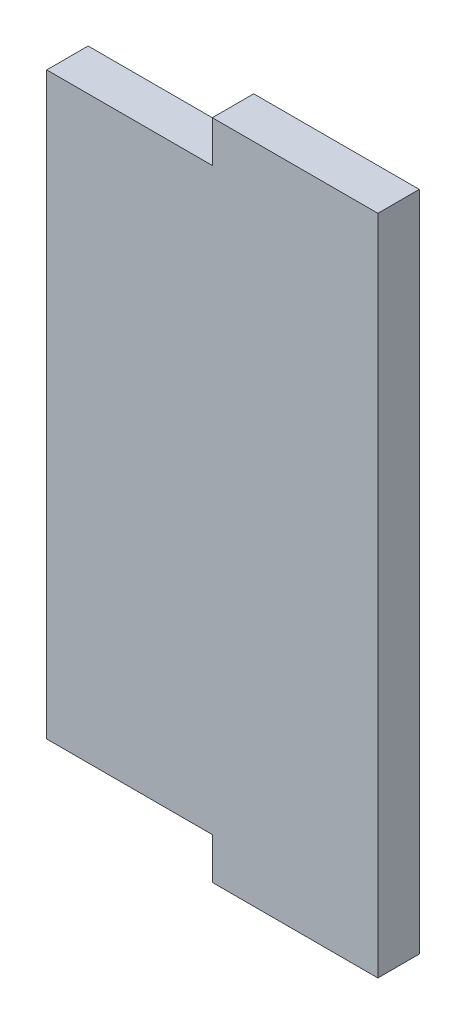
ISO-10303-21;
HEADER;
FILE_DESCRIPTION(('STEP AP214'),'2;1');
FILE_NAME('part.step','',(''),(''),'','','');
FILE_SCHEMA(('AUTOMOTIVE_DESIGN { 1 0 10303 214 1 1 1 1 }'));
ENDSEC;
DATA;
#1=APPLICATION_CONTEXT('core data for automotive mechanical design processes');
#2=APPLICATION_PROTOCOL_DEFINITION('international standard','automotive_design',2000,#1);
#3=PRODUCT_CONTEXT('',#1,'mechanical');
#4=PRODUCT('Part','Part','',(#3));
#5=PRODUCT_RELATED_PRODUCT_CATEGORY('part','',(#4));
#6=PRODUCT_DEFINITION_FORMATION('','',#4);
#7=PRODUCT_DEFINITION_CONTEXT('part definition',#1,'design');
#8=PRODUCT_DEFINITION('design','',#6,#7);
#9=PRODUCT_DEFINITION_SHAPE('','',#8);
#10=(LENGTH_UNIT() NAMED_UNIT(*) SI_UNIT(.MILLI.,.METRE.));
#11=(NAMED_UNIT(*) PLANE_ANGLE_UNIT() SI_UNIT($,.RADIAN.));
#12=(NAMED_UNIT(*) SI_UNIT($,.STERADIAN.) SOLID_ANGLE_UNIT());
#13=UNCERTAINTY_MEASURE_WITH_UNIT(LENGTH_MEASURE(1.E-05),#10,'distance_accuracy_value','');
#14=(GEOMETRIC_REPRESENTATION_CONTEXT(3) GLOBAL_UNCERTAINTY_ASSIGNED_CONTEXT((#13)) GLOBAL_UNIT_ASSIGNED_CONTEXT((#10,
#11,#12)) REPRESENTATION_CONTEXT('',''));
#15=CARTESIAN_POINT('',(0.,0.,0.));
#16=DIRECTION('',(0.,0.,1.));
#17=DIRECTION('',(1.,0.,0.));
#18=AXIS2_PLACEMENT_3D('',#15,#16,#17);
#19=CARTESIAN_POINT('',(98.425,0.,3.175));
#20=DIRECTION('',(0.,-1.,0.));
#21=DIRECTION('',(0.,0.,-1.));
#22=AXIS2_PLACEMENT_3D('',#19,#20,#21);
#23=PLANE('',#22);
#24=DIRECTION('',(-1.,0.,0.));
#25=VECTOR('',#24,1.);
#26=CARTESIAN_POINT('',(98.425,0.,0.));
#27=LINE('',#26,#25);
#28=CARTESIAN_POINT('',(98.425,0.,0.));
#29=VERTEX_POINT('',#28);
#30=CARTESIAN_POINT('',(85.725,0.,0.));
#31=VERTEX_POINT('',#30);
#32=EDGE_CURVE('E129',#29,#31,#27,.T.);
#33=ORIENTED_EDGE('',*,*,#32,.T.);
#34=DIRECTION('',(0.,0.,-1.));
#35=VECTOR('',#34,1.);
#36=CARTESIAN_POINT('',(85.725,0.,3.175));
#37=LINE('',#36,#35);
#38=CARTESIAN_POINT('',(85.725,0.,3.175));
#39=VERTEX_POINT('',#38);
#40=EDGE_CURVE('E11',#39,#31,#37,.T.);
#41=ORIENTED_EDGE('',*,*,#40,.F.);
#42=DIRECTION('',(-1.,0.,0.));
#43=VECTOR('',#42,1.);
#44=CARTESIAN_POINT('',(98.425,0.,3.175));
#45=LINE('',#44,#43);
#46=CARTESIAN_POINT('',(98.425,0.,3.175));
#47=VERTEX_POINT('',#46);
#48=EDGE_CURVE('E148',#47,#39,#45,.T.);
#49=ORIENTED_EDGE('',*,*,#48,.F.);
#50=DIRECTION('',(0.,0.,-1.));
#51=VECTOR('',#50,1.);
#52=CARTESIAN_POINT('',(98.425,0.,3.175));
#53=LINE('',#52,#51);
#54=EDGE_CURVE('E49',#47,#29,#53,.T.);
#55=ORIENTED_EDGE('',*,*,#54,.T.);
#56=EDGE_LOOP('',(#33,#41,#49,#55));
#57=FACE_BOUND('',#56,.T.);
#58=ADVANCED_FACE('F33',(#57),#23,.F.);
#59=CARTESIAN_POINT('',(85.725,0.,3.175));
#60=DIRECTION('',(1.,0.,0.));
#61=DIRECTION('',(0.,0.,-1.));
#62=AXIS2_PLACEMENT_3D('',#59,#60,#61);
#63=PLANE('',#62);
#64=DIRECTION('',(0.,-1.,0.));
#65=VECTOR('',#64,1.);
#66=CARTESIAN_POINT('',(85.725,0.,0.));
#67=LINE('',#66,#65);
#68=CARTESIAN_POINT('',(85.725,-3.175,0.));
#69=VERTEX_POINT('',#68);
#70=EDGE_CURVE('E131',#31,#69,#67,.T.);
#71=ORIENTED_EDGE('',*,*,#70,.T.);
#72=DIRECTION('',(0.,0.,-1.));
#73=VECTOR('',#72,1.);
#74=CARTESIAN_POINT('',(85.725,-3.175,3.175));
#75=LINE('',#74,#73);
#76=CARTESIAN_POINT('',(85.725,-3.175,3.175));
#77=VERTEX_POINT('',#76);
#78=EDGE_CURVE('E41',#77,#69,#75,.T.);
#79=ORIENTED_EDGE('',*,*,#78,.F.);
#80=DIRECTION('',(0.,-1.,0.));
#81=VECTOR('',#80,1.);
#82=CARTESIAN_POINT('',(85.725,0.,3.175));
#83=LINE('',#82,#81);
#84=EDGE_CURVE('E87',#39,#77,#83,.T.);
#85=ORIENTED_EDGE('',*,*,#84,.F.);
#86=ORIENTED_EDGE('',*,*,#40,.T.);
#87=EDGE_LOOP('',(#71,#79,#85,#86));
#88=FACE_BOUND('',#87,.T.);
#89=ADVANCED_FACE('F162',(#88),#63,.F.);
#90=CARTESIAN_POINT('',(73.025,-3.175,3.175));
#91=DIRECTION('',(0.,1.,0.));
#92=DIRECTION('',(0.,0.,1.));
#93=AXIS2_PLACEMENT_3D('',#90,#91,#92);
#94=PLANE('',#93);
#95=DIRECTION('',(1.,0.,0.));
#96=VECTOR('',#95,1.);
#97=CARTESIAN_POINT('',(73.025,-3.175,0.));
#98=LINE('',#97,#96);
#99=CARTESIAN_POINT('',(73.025,-3.175,0.));
#100=VERTEX_POINT('',#99);
#101=EDGE_CURVE('E134',#100,#69,#98,.T.);
#102=ORIENTED_EDGE('',*,*,#101,.F.);
#103=DIRECTION('',(0.,0.,-1.));
#104=VECTOR('',#103,1.);
#105=CARTESIAN_POINT('',(73.025,-3.175,3.175));
#106=LINE('',#105,#104);
#107=CARTESIAN_POINT('',(73.025,-3.175,3.175));
#108=VERTEX_POINT('',#107);
#109=EDGE_CURVE('E155',#108,#100,#106,.T.);
#110=ORIENTED_EDGE('',*,*,#109,.F.);
#111=DIRECTION('',(1.,0.,0.));
#112=VECTOR('',#111,1.);
#113=CARTESIAN_POINT('',(73.025,-3.175,3.175));
#114=LINE('',#113,#112);
#115=EDGE_CURVE('E161',#108,#77,#114,.T.);
#116=ORIENTED_EDGE('',*,*,#115,.T.);
#117=ORIENTED_EDGE('',*,*,#78,.T.);
#118=EDGE_LOOP('',(#102,#110,#116,#117));
#119=FACE_BOUND('',#118,.T.);
#120=ADVANCED_FACE('F159',(#119),#94,.T.);
#121=CARTESIAN_POINT('',(73.025,-3.175,3.175));
#122=DIRECTION('',(1.,0.,0.));
#123=DIRECTION('',(0.,0.,-1.));
#124=AXIS2_PLACEMENT_3D('',#121,#122,#123);
#125=PLANE('',#124);
#126=DIRECTION('',(0.,-1.,0.));
#127=VECTOR('',#126,1.);
#128=CARTESIAN_POINT('',(73.025,-3.175,0.));
#129=LINE('',#128,#127);
#130=CARTESIAN_POINT('',(73.025,-47.625,0.));
#131=VERTEX_POINT('',#130);
#132=EDGE_CURVE('E137',#100,#131,#129,.T.);
#133=ORIENTED_EDGE('',*,*,#132,.T.);
#134=DIRECTION('',(0.,0.,-1.));
#135=VECTOR('',#134,1.);
#136=CARTESIAN_POINT('',(73.025,-47.625,3.175));
#137=LINE('',#136,#135);
#138=CARTESIAN_POINT('',(73.025,-47.625,3.175));
#139=VERTEX_POINT('',#138);
#140=EDGE_CURVE('E152',#139,#131,#137,.T.);
#141=ORIENTED_EDGE('',*,*,#140,.F.);
#142=DIRECTION('',(0.,-1.,0.));
#143=VECTOR('',#142,1.);
#144=CARTESIAN_POINT('',(73.025,-3.175,3.175));
#145=LINE('',#144,#143);
#146=EDGE_CURVE('E174',#108,#139,#145,.T.);
#147=ORIENTED_EDGE('',*,*,#146,.F.);
#148=ORIENTED_EDGE('',*,*,#109,.T.);
#149=EDGE_LOOP('',(#133,#141,#147,#148));
#150=FACE_BOUND('',#149,.T.);
#151=ADVANCED_FACE('F170',(#150),#125,.F.);
#152=CARTESIAN_POINT('',(73.025,-47.625,3.175));
#153=DIRECTION('',(0.,1.,0.));
#154=DIRECTION('',(0.,0.,1.));
#155=AXIS2_PLACEMENT_3D('',#152,#153,#154);
#156=PLANE('',#155);
#157=DIRECTION('',(1.,0.,0.));
#158=VECTOR('',#157,1.);
#159=CARTESIAN_POINT('',(73.025,-47.625,0.));
#160=LINE('',#159,#158);
#161=CARTESIAN_POINT('',(85.725,-47.625,0.));
#162=VERTEX_POINT('',#161);
#163=EDGE_CURVE('E139',#131,#162,#160,.T.);
#164=ORIENTED_EDGE('',*,*,#163,.T.);
#165=DIRECTION('',(0.,0.,-1.));
#166=VECTOR('',#165,1.);
#167=CARTESIAN_POINT('',(85.725,-47.625,3.175));
#168=LINE('',#167,#166);
#169=CARTESIAN_POINT('',(85.725,-47.625,3.175));
#170=VERTEX_POINT('',#169);
#171=EDGE_CURVE('E112',#170,#162,#168,.T.);
#172=ORIENTED_EDGE('',*,*,#171,.F.);
#173=DIRECTION('',(1.,0.,0.));
#174=VECTOR('',#173,1.);
#175=CARTESIAN_POINT('',(73.025,-47.625,3.175));
#176=LINE('',#175,#174);
#177=EDGE_CURVE('E120',#139,#170,#176,.T.);
#178=ORIENTED_EDGE('',*,*,#177,.F.);
#179=ORIENTED_EDGE('',*,*,#140,.T.);
#180=EDGE_LOOP('',(#164,#172,#178,#179));
#181=FACE_BOUND('',#180,.T.);
#182=ADVANCED_FACE('F173',(#181),#156,.F.);
#183=CARTESIAN_POINT('',(85.725,-50.8,3.175));
#184=DIRECTION('',(-1.,0.,0.));
#185=DIRECTION('',(0.,0.,1.));
#186=AXIS2_PLACEMENT_3D('',#183,#184,#185);
#187=PLANE('',#186);
#188=DIRECTION('',(0.,1.,0.));
#189=VECTOR('',#188,1.);
#190=CARTESIAN_POINT('',(85.725,-50.8,0.));
#191=LINE('',#190,#189);
#192=CARTESIAN_POINT('',(85.725,-50.8,0.));
#193=VERTEX_POINT('',#192);
#194=EDGE_CURVE('E108',#193,#162,#191,.T.);
#195=ORIENTED_EDGE('',*,*,#194,.F.);
#196=DIRECTION('',(0.,0.,-1.));
#197=VECTOR('',#196,1.);
#198=CARTESIAN_POINT('',(85.725,-50.8,3.175));
#199=LINE('',#198,#197);
#200=CARTESIAN_POINT('',(85.725,-50.8,3.175));
#201=VERTEX_POINT('',#200);
#202=EDGE_CURVE('E103',#201,#193,#199,.T.);
#203=ORIENTED_EDGE('',*,*,#202,.F.);
#204=DIRECTION('',(0.,1.,0.));
#205=VECTOR('',#204,1.);
#206=CARTESIAN_POINT('',(85.725,-50.8,3.175));
#207=LINE('',#206,#205);
#208=EDGE_CURVE('E106',#201,#170,#207,.T.);
#209=ORIENTED_EDGE('',*,*,#208,.T.);
#210=ORIENTED_EDGE('',*,*,#171,.T.);
#211=EDGE_LOOP('',(#195,#203,#209,#210));
#212=FACE_BOUND('',#211,.T.);
#213=ADVANCED_FACE('F105',(#212),#187,.T.);
#214=CARTESIAN_POINT('',(98.425,-50.8,3.175));
#215=DIRECTION('',(0.,-1.,0.));
#216=DIRECTION('',(0.,0.,-1.));
#217=AXIS2_PLACEMENT_3D('',#214,#215,#216);
#218=PLANE('',#217);
#219=DIRECTION('',(-1.,0.,0.));
#220=VECTOR('',#219,1.);
#221=CARTESIAN_POINT('',(98.425,-50.8,0.));
#222=LINE('',#221,#220);
#223=CARTESIAN_POINT('',(98.425,-50.8,0.));
#224=VERTEX_POINT('',#223);
#225=EDGE_CURVE('E143',#224,#193,#222,.T.);
#226=ORIENTED_EDGE('',*,*,#225,.F.);
#227=DIRECTION('',(0.,0.,-1.));
#228=VECTOR('',#227,1.);
#229=CARTESIAN_POINT('',(98.425,-50.8,3.175));
#230=LINE('',#229,#228);
#231=CARTESIAN_POINT('',(98.425,-50.8,3.175));
#232=VERTEX_POINT('',#231);
#233=EDGE_CURVE('E75',#232,#224,#230,.T.);
#234=ORIENTED_EDGE('',*,*,#233,.F.);
#235=DIRECTION('',(-1.,0.,0.));
#236=VECTOR('',#235,1.);
#237=CARTESIAN_POINT('',(98.425,-50.8,3.175));
#238=LINE('',#237,#236);
#239=EDGE_CURVE('E118',#232,#201,#238,.T.);
#240=ORIENTED_EDGE('',*,*,#239,.T.);
#241=ORIENTED_EDGE('',*,*,#202,.T.);
#242=EDGE_LOOP('',(#226,#234,#240,#241));
#243=FACE_BOUND('',#242,.T.);
#244=ADVANCED_FACE('F123',(#243),#218,.T.);
#245=CARTESIAN_POINT('',(98.425,0.,3.175));
#246=DIRECTION('',(1.,0.,0.));
#247=DIRECTION('',(0.,0.,-1.));
#248=AXIS2_PLACEMENT_3D('',#245,#246,#247);
#249=PLANE('',#248);
#250=DIRECTION('',(0.,-1.,0.));
#251=VECTOR('',#250,1.);
#252=CARTESIAN_POINT('',(98.425,0.,0.));
#253=LINE('',#252,#251);
#254=EDGE_CURVE('E145',#29,#224,#253,.T.);
#255=ORIENTED_EDGE('',*,*,#254,.F.);
#256=ORIENTED_EDGE('',*,*,#54,.F.);
#257=DIRECTION('',(0.,-1.,0.));
#258=VECTOR('',#257,1.);
#259=CARTESIAN_POINT('',(98.425,0.,3.175));
#260=LINE('',#259,#258);
#261=EDGE_CURVE('E124',#47,#232,#260,.T.);
#262=ORIENTED_EDGE('',*,*,#261,.T.);
#263=ORIENTED_EDGE('',*,*,#233,.T.);
#264=EDGE_LOOP('',(#255,#256,#262,#263));
#265=FACE_BOUND('',#264,.T.);
#266=ADVANCED_FACE('F179',(#265),#249,.T.);
#267=CARTESIAN_POINT('',(0.,0.,3.175));
#268=DIRECTION('',(0.,0.,1.));
#269=DIRECTION('',(1.,0.,0.));
#270=AXIS2_PLACEMENT_3D('',#267,#268,#269);
#271=PLANE('',#270);
#272=ORIENTED_EDGE('',*,*,#48,.T.);
#273=ORIENTED_EDGE('',*,*,#84,.T.);
#274=ORIENTED_EDGE('',*,*,#115,.F.);
#275=ORIENTED_EDGE('',*,*,#146,.T.);
#276=ORIENTED_EDGE('',*,*,#177,.T.);
#277=ORIENTED_EDGE('',*,*,#208,.F.);
#278=ORIENTED_EDGE('',*,*,#239,.F.);
#279=ORIENTED_EDGE('',*,*,#261,.F.);
#280=EDGE_LOOP('',(#272,#273,#274,#275,#276,#277,#278,#279));
#281=FACE_BOUND('',#280,.T.);
#282=ADVANCED_FACE('F116',(#281),#271,.T.);
#283=CARTESIAN_POINT('',(0.,0.,0.));
#284=DIRECTION('',(0.,0.,1.));
#285=DIRECTION('',(1.,0.,0.));
#286=AXIS2_PLACEMENT_3D('',#283,#284,#285);
#287=PLANE('',#286);
#288=ORIENTED_EDGE('',*,*,#32,.F.);
#289=ORIENTED_EDGE('',*,*,#254,.T.);
#290=ORIENTED_EDGE('',*,*,#225,.T.);
#291=ORIENTED_EDGE('',*,*,#194,.T.);
#292=ORIENTED_EDGE('',*,*,#163,.F.);
#293=ORIENTED_EDGE('',*,*,#132,.F.);
#294=ORIENTED_EDGE('',*,*,#101,.T.);
#295=ORIENTED_EDGE('',*,*,#70,.F.);
#296=EDGE_LOOP('',(#288,#289,#290,#291,#292,#293,#294,#295));
#297=FACE_BOUND('',#296,.T.);
#298=ADVANCED_FACE('F166',(#297),#287,.F.);
#299=CLOSED_SHELL('',(#58,#89,#120,#151,#182,#213,#244,#266,#282,#298));
#300=MANIFOLD_SOLID_BREP('B2',#299);
#301=ADVANCED_BREP_SHAPE_REPRESENTATION('',(#18,#300),#14);
#302=SHAPE_DEFINITION_REPRESENTATION(#9,#301);
ENDSEC;
END-ISO-10303-21;
